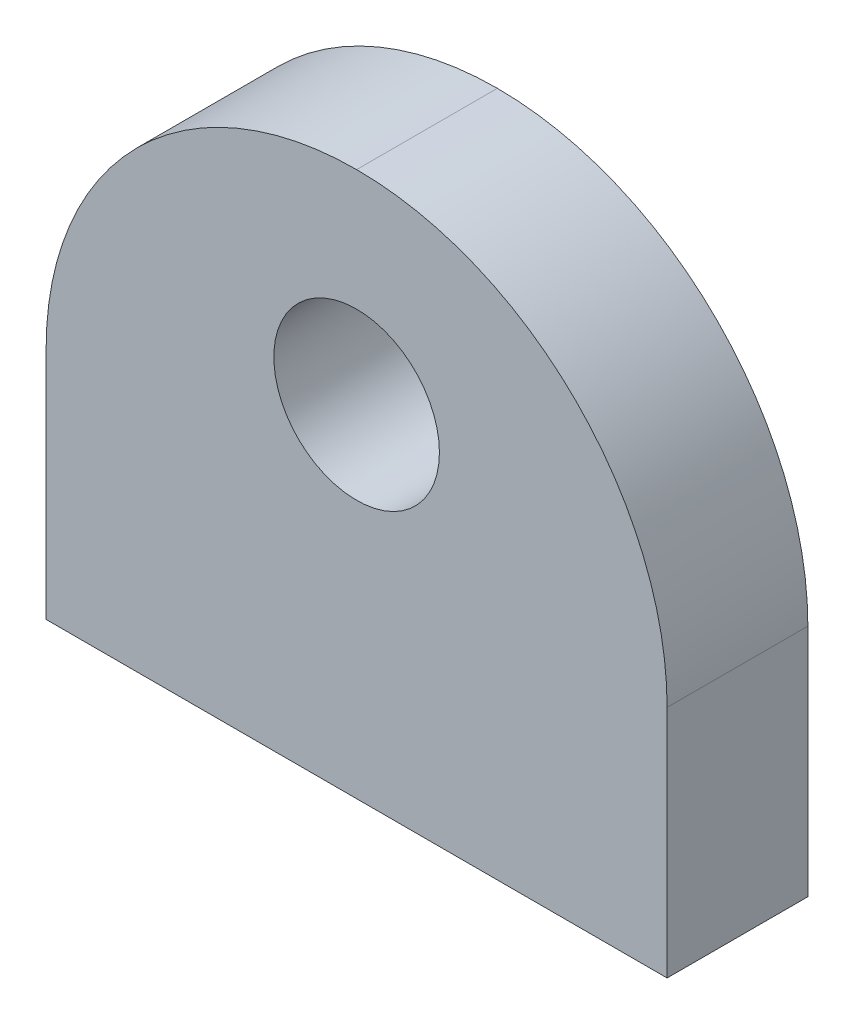
ISO-10303-21;
HEADER;
FILE_DESCRIPTION(('STEP AP214'),'2;1');
FILE_NAME('part.step','',(''),(''),'','','');
FILE_SCHEMA(('AUTOMOTIVE_DESIGN { 1 0 10303 214 1 1 1 1 }'));
ENDSEC;
DATA;
#1=APPLICATION_CONTEXT('core data for automotive mechanical design processes');
#2=APPLICATION_PROTOCOL_DEFINITION('international standard','automotive_design',2000,#1);
#3=PRODUCT_CONTEXT('',#1,'mechanical');
#4=PRODUCT('Part','Part','',(#3));
#5=PRODUCT_RELATED_PRODUCT_CATEGORY('part','',(#4));
#6=PRODUCT_DEFINITION_FORMATION('','',#4);
#7=PRODUCT_DEFINITION_CONTEXT('part definition',#1,'design');
#8=PRODUCT_DEFINITION('design','',#6,#7);
#9=PRODUCT_DEFINITION_SHAPE('','',#8);
#10=(LENGTH_UNIT() NAMED_UNIT(*) SI_UNIT(.MILLI.,.METRE.));
#11=(NAMED_UNIT(*) PLANE_ANGLE_UNIT() SI_UNIT($,.RADIAN.));
#12=(NAMED_UNIT(*) SI_UNIT($,.STERADIAN.) SOLID_ANGLE_UNIT());
#13=UNCERTAINTY_MEASURE_WITH_UNIT(LENGTH_MEASURE(1.E-05),#10,'distance_accuracy_value','');
#14=(GEOMETRIC_REPRESENTATION_CONTEXT(3) GLOBAL_UNCERTAINTY_ASSIGNED_CONTEXT((#13)) GLOBAL_UNIT_ASSIGNED_CONTEXT((#10,
#11,#12)) REPRESENTATION_CONTEXT('',''));
#15=CARTESIAN_POINT('',(0.,0.,0.));
#16=DIRECTION('',(0.,0.,1.));
#17=DIRECTION('',(1.,0.,0.));
#18=AXIS2_PLACEMENT_3D('',#15,#16,#17);
#19=CARTESIAN_POINT('',(0.,0.,6.8));
#20=DIRECTION('',(1.,0.,0.));
#21=DIRECTION('',(0.,0.,-1.));
#22=AXIS2_PLACEMENT_3D('',#19,#20,#21);
#23=PLANE('',#22);
#24=DIRECTION('',(0.,-1.,0.));
#25=VECTOR('',#24,1.);
#26=CARTESIAN_POINT('',(0.,0.,6.8));
#27=LINE('',#26,#25);
#28=CARTESIAN_POINT('',(0.,11.3225806451613,6.8));
#29=VERTEX_POINT('',#28);
#30=CARTESIAN_POINT('',(0.,0.,6.8));
#31=VERTEX_POINT('',#30);
#32=EDGE_CURVE('E90',#29,#31,#27,.T.);
#33=ORIENTED_EDGE('',*,*,#32,.F.);
#34=DIRECTION('',(0.,0.,-1.));
#35=VECTOR('',#34,1.);
#36=CARTESIAN_POINT('',(0.,11.3225806451613,6.8));
#37=LINE('',#36,#35);
#38=CARTESIAN_POINT('',(0.,11.3225806451613,0.));
#39=VERTEX_POINT('',#38);
#40=EDGE_CURVE('E116',#29,#39,#37,.T.);
#41=ORIENTED_EDGE('',*,*,#40,.T.);
#42=DIRECTION('',(0.,-1.,0.));
#43=VECTOR('',#42,1.);
#44=CARTESIAN_POINT('',(0.,0.,0.));
#45=LINE('',#44,#43);
#46=CARTESIAN_POINT('',(0.,0.,0.));
#47=VERTEX_POINT('',#46);
#48=EDGE_CURVE('E113',#39,#47,#45,.T.);
#49=ORIENTED_EDGE('',*,*,#48,.T.);
#50=DIRECTION('',(0.,0.,-1.));
#51=VECTOR('',#50,1.);
#52=CARTESIAN_POINT('',(0.,0.,6.8));
#53=LINE('',#52,#51);
#54=EDGE_CURVE('E106',#31,#47,#53,.T.);
#55=ORIENTED_EDGE('',*,*,#54,.F.);
#56=EDGE_LOOP('',(#33,#41,#49,#55));
#57=FACE_BOUND('',#56,.T.);
#58=ADVANCED_FACE('F43',(#57),#23,.F.);
#59=CARTESIAN_POINT('',(0.,0.,6.8));
#60=DIRECTION('',(0.,1.,0.));
#61=DIRECTION('',(0.,0.,1.));
#62=AXIS2_PLACEMENT_3D('',#59,#60,#61);
#63=PLANE('',#62);
#64=DIRECTION('',(1.,0.,0.));
#65=VECTOR('',#64,1.);
#66=CARTESIAN_POINT('',(0.,0.,0.));
#67=LINE('',#66,#65);
#68=CARTESIAN_POINT('',(30.,0.,0.));
#69=VERTEX_POINT('',#68);
#70=EDGE_CURVE('E145',#47,#69,#67,.T.);
#71=ORIENTED_EDGE('',*,*,#70,.T.);
#72=DIRECTION('',(0.,0.,-1.));
#73=VECTOR('',#72,1.);
#74=CARTESIAN_POINT('',(30.,0.,6.8));
#75=LINE('',#74,#73);
#76=CARTESIAN_POINT('',(30.,0.,6.8));
#77=VERTEX_POINT('',#76);
#78=EDGE_CURVE('E108',#77,#69,#75,.T.);
#79=ORIENTED_EDGE('',*,*,#78,.F.);
#80=DIRECTION('',(1.,0.,0.));
#81=VECTOR('',#80,1.);
#82=CARTESIAN_POINT('',(0.,0.,6.8));
#83=LINE('',#82,#81);
#84=EDGE_CURVE('E93',#31,#77,#83,.T.);
#85=ORIENTED_EDGE('',*,*,#84,.F.);
#86=ORIENTED_EDGE('',*,*,#54,.T.);
#87=EDGE_LOOP('',(#71,#79,#85,#86));
#88=FACE_BOUND('',#87,.T.);
#89=ADVANCED_FACE('F105',(#88),#63,.F.);
#90=CARTESIAN_POINT('',(30.,26.3225806451613,6.8));
#91=DIRECTION('',(-1.,0.,0.));
#92=DIRECTION('',(0.,0.,1.));
#93=AXIS2_PLACEMENT_3D('',#90,#91,#92);
#94=PLANE('',#93);
#95=DIRECTION('',(0.,1.,0.));
#96=VECTOR('',#95,1.);
#97=CARTESIAN_POINT('',(30.,26.3225806451613,0.));
#98=LINE('',#97,#96);
#99=CARTESIAN_POINT('',(30.,11.3225806451613,0.));
#100=VERTEX_POINT('',#99);
#101=EDGE_CURVE('E101',#69,#100,#98,.T.);
#102=ORIENTED_EDGE('',*,*,#101,.T.);
#103=DIRECTION('',(0.,0.,-1.));
#104=VECTOR('',#103,1.);
#105=CARTESIAN_POINT('',(30.,11.3225806451613,6.8));
#106=LINE('',#105,#104);
#107=CARTESIAN_POINT('',(30.,11.3225806451613,6.8));
#108=VERTEX_POINT('',#107);
#109=EDGE_CURVE('E11',#100,#108,#106,.F.);
#110=ORIENTED_EDGE('',*,*,#109,.T.);
#111=DIRECTION('',(0.,1.,0.));
#112=VECTOR('',#111,1.);
#113=CARTESIAN_POINT('',(30.,26.3225806451613,6.8));
#114=LINE('',#113,#112);
#115=EDGE_CURVE('E110',#77,#108,#114,.T.);
#116=ORIENTED_EDGE('',*,*,#115,.F.);
#117=ORIENTED_EDGE('',*,*,#78,.T.);
#118=EDGE_LOOP('',(#102,#110,#116,#117));
#119=FACE_BOUND('',#118,.T.);
#120=ADVANCED_FACE('F160',(#119),#94,.F.);
#121=CARTESIAN_POINT('',(0.,0.,6.8));
#122=DIRECTION('',(0.,0.,-1.));
#123=DIRECTION('',(-1.,0.,0.));
#124=AXIS2_PLACEMENT_3D('',#121,#122,#123);
#125=PLANE('',#124);
#126=CARTESIAN_POINT('',(15.,16.4855725235854,6.8));
#127=DIRECTION('',(0.,0.,1.));
#128=DIRECTION('',(1.,0.,0.));
#129=AXIS2_PLACEMENT_3D('',#126,#127,#128);
#130=CIRCLE('',#129,4.);
#131=CARTESIAN_POINT('',(19.,16.4855725235854,6.8));
#132=VERTEX_POINT('',#131);
#133=EDGE_CURVE('E142',#132,#132,#130,.T.);
#134=ORIENTED_EDGE('',*,*,#133,.F.);
#135=EDGE_LOOP('',(#134));
#136=FACE_BOUND('',#135,.T.);
#137=CARTESIAN_POINT('',(15.,11.3225806451613,6.8));
#138=DIRECTION('',(0.,0.,-1.));
#139=DIRECTION('',(-1.,0.,0.));
#140=AXIS2_PLACEMENT_3D('',#137,#138,#139);
#141=CIRCLE('',#140,15.);
#142=CARTESIAN_POINT('',(15.,26.3225806451613,6.8));
#143=VERTEX_POINT('',#142);
#144=EDGE_CURVE('E60',#108,#143,#141,.F.);
#145=ORIENTED_EDGE('',*,*,#144,.T.);
#146=CARTESIAN_POINT('',(15.,11.3225806451613,6.8));
#147=DIRECTION('',(0.,0.,-1.));
#148=DIRECTION('',(-1.,0.,0.));
#149=AXIS2_PLACEMENT_3D('',#146,#147,#148);
#150=CIRCLE('',#149,15.);
#151=EDGE_CURVE('E53',#143,#29,#150,.F.);
#152=ORIENTED_EDGE('',*,*,#151,.T.);
#153=ORIENTED_EDGE('',*,*,#32,.T.);
#154=ORIENTED_EDGE('',*,*,#84,.T.);
#155=ORIENTED_EDGE('',*,*,#115,.T.);
#156=EDGE_LOOP('',(#145,#152,#153,#154,#155));
#157=FACE_BOUND('',#156,.T.);
#158=ADVANCED_FACE('F92',(#136,#157),#125,.F.);
#159=CARTESIAN_POINT('',(0.,0.,0.));
#160=DIRECTION('',(0.,0.,-1.));
#161=DIRECTION('',(-1.,0.,0.));
#162=AXIS2_PLACEMENT_3D('',#159,#160,#161);
#163=PLANE('',#162);
#164=CARTESIAN_POINT('',(15.,16.4855725235854,0.));
#165=DIRECTION('',(0.,0.,-1.));
#166=DIRECTION('',(-1.,0.,0.));
#167=AXIS2_PLACEMENT_3D('',#164,#165,#166);
#168=CIRCLE('',#167,4.);
#169=CARTESIAN_POINT('',(11.,16.4855725235854,0.));
#170=VERTEX_POINT('',#169);
#171=EDGE_CURVE('E148',#170,#170,#168,.F.);
#172=ORIENTED_EDGE('',*,*,#171,.T.);
#173=EDGE_LOOP('',(#172));
#174=FACE_BOUND('',#173,.T.);
#175=ORIENTED_EDGE('',*,*,#48,.F.);
#176=CARTESIAN_POINT('',(15.,11.3225806451613,0.));
#177=DIRECTION('',(0.,0.,-1.));
#178=DIRECTION('',(-1.,0.,0.));
#179=AXIS2_PLACEMENT_3D('',#176,#177,#178);
#180=CIRCLE('',#179,15.);
#181=CARTESIAN_POINT('',(15.,26.3225806451613,0.));
#182=VERTEX_POINT('',#181);
#183=EDGE_CURVE('E127',#39,#182,#180,.T.);
#184=ORIENTED_EDGE('',*,*,#183,.T.);
#185=CARTESIAN_POINT('',(15.,11.3225806451613,0.));
#186=DIRECTION('',(0.,0.,-1.));
#187=DIRECTION('',(-1.,0.,0.));
#188=AXIS2_PLACEMENT_3D('',#185,#186,#187);
#189=CIRCLE('',#188,15.);
#190=EDGE_CURVE('E120',#182,#100,#189,.T.);
#191=ORIENTED_EDGE('',*,*,#190,.T.);
#192=ORIENTED_EDGE('',*,*,#101,.F.);
#193=ORIENTED_EDGE('',*,*,#70,.F.);
#194=EDGE_LOOP('',(#175,#184,#191,#192,#193));
#195=FACE_BOUND('',#194,.T.);
#196=ADVANCED_FACE('F135',(#174,#195),#163,.T.);
#197=CARTESIAN_POINT('',(15.,11.3225806451613,6.8));
#198=DIRECTION('',(0.,0.,-1.));
#199=DIRECTION('',(-1.,0.,0.));
#200=AXIS2_PLACEMENT_3D('',#197,#198,#199);
#201=CYLINDRICAL_SURFACE('',#200,15.);
#202=DIRECTION('',(0.,0.,-1.));
#203=VECTOR('',#202,1.);
#204=CARTESIAN_POINT('',(15.,26.3225806451613,6.8));
#205=LINE('',#204,#203);
#206=EDGE_CURVE('E47',#143,#182,#205,.T.);
#207=ORIENTED_EDGE('',*,*,#206,.F.);
#208=ORIENTED_EDGE('',*,*,#144,.F.);
#209=ORIENTED_EDGE('',*,*,#109,.F.);
#210=ORIENTED_EDGE('',*,*,#190,.F.);
#211=EDGE_LOOP('',(#207,#208,#209,#210));
#212=FACE_BOUND('',#211,.T.);
#213=ADVANCED_FACE('F45',(#212),#201,.T.);
#214=CARTESIAN_POINT('',(15.,11.3225806451613,6.8));
#215=DIRECTION('',(0.,0.,-1.));
#216=DIRECTION('',(-1.,0.,0.));
#217=AXIS2_PLACEMENT_3D('',#214,#215,#216);
#218=CYLINDRICAL_SURFACE('',#217,15.);
#219=ORIENTED_EDGE('',*,*,#151,.F.);
#220=ORIENTED_EDGE('',*,*,#206,.T.);
#221=ORIENTED_EDGE('',*,*,#183,.F.);
#222=ORIENTED_EDGE('',*,*,#40,.F.);
#223=EDGE_LOOP('',(#219,#220,#221,#222));
#224=FACE_BOUND('',#223,.T.);
#225=ADVANCED_FACE('F140',(#224),#218,.T.);
#226=CARTESIAN_POINT('',(15.,16.4855725235854,-0.00100000000000013));
#227=DIRECTION('',(0.,0.,1.));
#228=DIRECTION('',(1.,0.,0.));
#229=AXIS2_PLACEMENT_3D('',#226,#227,#228);
#230=CYLINDRICAL_SURFACE('',#229,4.);
#231=ORIENTED_EDGE('',*,*,#171,.F.);
#232=EDGE_LOOP('',(#231));
#233=FACE_BOUND('',#232,.T.);
#234=ORIENTED_EDGE('',*,*,#133,.T.);
#235=EDGE_LOOP('',(#234));
#236=FACE_BOUND('',#235,.T.);
#237=ADVANCED_FACE('F176',(#233,#236),#230,.F.);
#238=CLOSED_SHELL('',(#58,#89,#120,#158,#196,#213,#225,#237));
#239=MANIFOLD_SOLID_BREP('B2',#238);
#240=ADVANCED_BREP_SHAPE_REPRESENTATION('',(#18,#239),#14);
#241=SHAPE_DEFINITION_REPRESENTATION(#9,#240);
ENDSEC;
END-ISO-10303-21;
